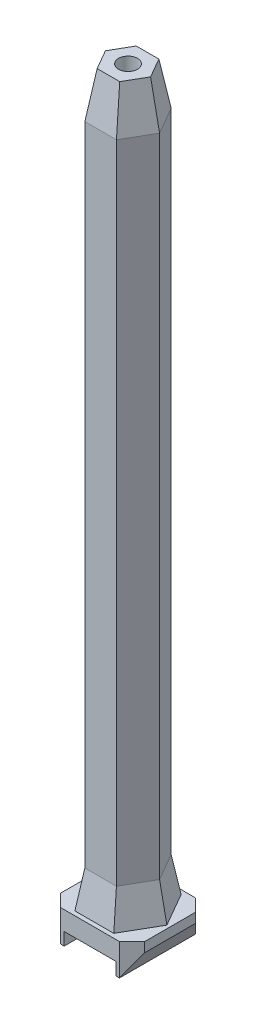
ISO-10303-21;
HEADER;
FILE_DESCRIPTION(('STEP AP214'),'2;1');
FILE_NAME('part.step','',(''),(''),'','','');
FILE_SCHEMA(('AUTOMOTIVE_DESIGN { 1 0 10303 214 1 1 1 1 }'));
ENDSEC;
DATA;
#1=APPLICATION_CONTEXT('core data for automotive mechanical design processes');
#2=APPLICATION_PROTOCOL_DEFINITION('international standard','automotive_design',2000,#1);
#3=PRODUCT_CONTEXT('',#1,'mechanical');
#4=PRODUCT('Part','Part','',(#3));
#5=PRODUCT_RELATED_PRODUCT_CATEGORY('part','',(#4));
#6=PRODUCT_DEFINITION_FORMATION('','',#4);
#7=PRODUCT_DEFINITION_CONTEXT('part definition',#1,'design');
#8=PRODUCT_DEFINITION('design','',#6,#7);
#9=PRODUCT_DEFINITION_SHAPE('','',#8);
#10=(LENGTH_UNIT() NAMED_UNIT(*) SI_UNIT(.MILLI.,.METRE.));
#11=(NAMED_UNIT(*) PLANE_ANGLE_UNIT() SI_UNIT($,.RADIAN.));
#12=(NAMED_UNIT(*) SI_UNIT($,.STERADIAN.) SOLID_ANGLE_UNIT());
#13=UNCERTAINTY_MEASURE_WITH_UNIT(LENGTH_MEASURE(1.E-05),#10,'distance_accuracy_value','');
#14=(GEOMETRIC_REPRESENTATION_CONTEXT(3) GLOBAL_UNCERTAINTY_ASSIGNED_CONTEXT((#13)) GLOBAL_UNIT_ASSIGNED_CONTEXT((#10,
#11,#12)) REPRESENTATION_CONTEXT('',''));
#15=CARTESIAN_POINT('',(0.,0.,0.));
#16=DIRECTION('',(0.,0.,1.));
#17=DIRECTION('',(1.,0.,0.));
#18=AXIS2_PLACEMENT_3D('',#15,#16,#17);
#19=CARTESIAN_POINT('',(6.64652567975831,120.,6.));
#20=DIRECTION('',(-1.,0.,0.));
#21=DIRECTION('',(0.,0.,1.));
#22=AXIS2_PLACEMENT_3D('',#19,#20,#21);
#23=PLANE('',#22);
#24=DIRECTION('',(0.,-1.,0.));
#25=VECTOR('',#24,1.);
#26=CARTESIAN_POINT('',(6.64652567975831,120.,3.99999999999998));
#27=LINE('',#26,#25);
#28=CARTESIAN_POINT('',(6.64652567975831,4.99999999999995,3.99999999999998));
#29=VERTEX_POINT('',#28);
#30=CARTESIAN_POINT('',(6.64652567975831,3.46410161513776,3.99999999999998));
#31=VERTEX_POINT('',#30);
#32=EDGE_CURVE('E293',#29,#31,#27,.T.);
#33=ORIENTED_EDGE('',*,*,#32,.T.);
#34=DIRECTION('',(0.,0.,-1.));
#35=VECTOR('',#34,1.);
#36=CARTESIAN_POINT('',(6.64652567975831,3.46410161513776,-4.));
#37=LINE('',#36,#35);
#38=CARTESIAN_POINT('',(6.64652567975831,3.46410161513776,-4.));
#39=VERTEX_POINT('',#38);
#40=EDGE_CURVE('E341',#31,#39,#37,.T.);
#41=ORIENTED_EDGE('',*,*,#40,.T.);
#42=DIRECTION('',(0.,1.,0.));
#43=VECTOR('',#42,1.);
#44=CARTESIAN_POINT('',(6.64652567975831,120.,-4.));
#45=LINE('',#44,#43);
#46=CARTESIAN_POINT('',(6.64652567975831,4.99999999999995,-4.));
#47=VERTEX_POINT('',#46);
#48=EDGE_CURVE('E296',#39,#47,#45,.T.);
#49=ORIENTED_EDGE('',*,*,#48,.T.);
#50=DIRECTION('',(0.,0.,-1.));
#51=VECTOR('',#50,1.);
#52=CARTESIAN_POINT('',(6.64652567975831,4.99999999999995,6.));
#53=LINE('',#52,#51);
#54=EDGE_CURVE('E390',#29,#47,#53,.T.);
#55=ORIENTED_EDGE('',*,*,#54,.F.);
#56=EDGE_LOOP('',(#33,#41,#49,#55));
#57=FACE_BOUND('',#56,.T.);
#58=ADVANCED_FACE('F36',(#57),#23,.F.);
#59=CARTESIAN_POINT('',(-6.64652567975831,120.,-6.));
#60=DIRECTION('',(0.,0.,1.));
#61=DIRECTION('',(1.,0.,0.));
#62=AXIS2_PLACEMENT_3D('',#59,#60,#61);
#63=PLANE('',#62);
#64=DIRECTION('',(-1.,0.,0.));
#65=VECTOR('',#64,1.);
#66=CARTESIAN_POINT('',(-6.64652567975831,4.99999999999995,-6.));
#67=LINE('',#66,#65);
#68=CARTESIAN_POINT('',(4.64652567975831,4.99999999999995,-6.));
#69=VERTEX_POINT('',#68);
#70=CARTESIAN_POINT('',(-4.64652567975828,4.99999999999995,-6.));
#71=VERTEX_POINT('',#70);
#72=EDGE_CURVE('E387',#69,#71,#67,.T.);
#73=ORIENTED_EDGE('',*,*,#72,.F.);
#74=DIRECTION('',(0.,-1.,0.));
#75=VECTOR('',#74,1.);
#76=CARTESIAN_POINT('',(4.64652567975831,120.,-6.));
#77=LINE('',#76,#75);
#78=CARTESIAN_POINT('',(4.64652567975831,0.,-6.));
#79=VERTEX_POINT('',#78);
#80=EDGE_CURVE('E290',#69,#79,#77,.T.);
#81=ORIENTED_EDGE('',*,*,#80,.T.);
#82=DIRECTION('',(-1.,0.,0.));
#83=VECTOR('',#82,1.);
#84=CARTESIAN_POINT('',(-6.64652567975831,0.,-6.));
#85=LINE('',#84,#83);
#86=CARTESIAN_POINT('',(4.1,0.,-6.));
#87=VERTEX_POINT('',#86);
#88=EDGE_CURVE('E224',#79,#87,#85,.T.);
#89=ORIENTED_EDGE('',*,*,#88,.T.);
#90=DIRECTION('',(0.,1.,0.));
#91=VECTOR('',#90,1.);
#92=CARTESIAN_POINT('',(4.1,120.,-6.));
#93=LINE('',#92,#91);
#94=CARTESIAN_POINT('',(4.1,2.,-6.));
#95=VERTEX_POINT('',#94);
#96=EDGE_CURVE('E227',#87,#95,#93,.T.);
#97=ORIENTED_EDGE('',*,*,#96,.T.);
#98=DIRECTION('',(-1.,0.,0.));
#99=VECTOR('',#98,1.);
#100=CARTESIAN_POINT('',(-6.64652567975831,2.,-6.));
#101=LINE('',#100,#99);
#102=CARTESIAN_POINT('',(-4.1,2.,-6.));
#103=VERTEX_POINT('',#102);
#104=EDGE_CURVE('E220',#95,#103,#101,.T.);
#105=ORIENTED_EDGE('',*,*,#104,.T.);
#106=DIRECTION('',(0.,-1.,0.));
#107=VECTOR('',#106,1.);
#108=CARTESIAN_POINT('',(-4.1,120.,-6.));
#109=LINE('',#108,#107);
#110=CARTESIAN_POINT('',(-4.1,0.,-6.));
#111=VERTEX_POINT('',#110);
#112=EDGE_CURVE('E203',#103,#111,#109,.T.);
#113=ORIENTED_EDGE('',*,*,#112,.T.);
#114=CARTESIAN_POINT('',(-4.64652567975828,0.,-6.));
#115=VERTEX_POINT('',#114);
#116=EDGE_CURVE('E218',#111,#115,#85,.T.);
#117=ORIENTED_EDGE('',*,*,#116,.T.);
#118=DIRECTION('',(0.,1.,0.));
#119=VECTOR('',#118,1.);
#120=CARTESIAN_POINT('',(-4.64652567975828,120.,-6.));
#121=LINE('',#120,#119);
#122=EDGE_CURVE('E270',#115,#71,#121,.T.);
#123=ORIENTED_EDGE('',*,*,#122,.T.);
#124=EDGE_LOOP('',(#73,#81,#89,#97,#105,#113,#117,#123));
#125=FACE_BOUND('',#124,.T.);
#126=ADVANCED_FACE('F217',(#125),#63,.F.);
#127=CARTESIAN_POINT('',(-6.64652567975831,120.,6.));
#128=DIRECTION('',(1.,0.,0.));
#129=DIRECTION('',(0.,0.,-1.));
#130=AXIS2_PLACEMENT_3D('',#127,#128,#129);
#131=PLANE('',#130);
#132=DIRECTION('',(0.,-1.,0.));
#133=VECTOR('',#132,1.);
#134=CARTESIAN_POINT('',(-6.64652567975831,120.,-3.99999999999998));
#135=LINE('',#134,#133);
#136=CARTESIAN_POINT('',(-6.64652567975831,4.99999999999995,-3.99999999999998));
#137=VERTEX_POINT('',#136);
#138=CARTESIAN_POINT('',(-6.64652567975831,3.46410161513776,-3.99999999999998));
#139=VERTEX_POINT('',#138);
#140=EDGE_CURVE('E308',#137,#139,#135,.T.);
#141=ORIENTED_EDGE('',*,*,#140,.T.);
#142=DIRECTION('',(0.,0.,1.));
#143=VECTOR('',#142,1.);
#144=CARTESIAN_POINT('',(-6.64652567975831,3.46410161513776,4.));
#145=LINE('',#144,#143);
#146=CARTESIAN_POINT('',(-6.64652567975831,3.46410161513776,4.));
#147=VERTEX_POINT('',#146);
#148=EDGE_CURVE('E365',#139,#147,#145,.T.);
#149=ORIENTED_EDGE('',*,*,#148,.T.);
#150=DIRECTION('',(0.,1.,0.));
#151=VECTOR('',#150,1.);
#152=CARTESIAN_POINT('',(-6.64652567975831,120.,4.));
#153=LINE('',#152,#151);
#154=CARTESIAN_POINT('',(-6.64652567975831,4.99999999999995,4.));
#155=VERTEX_POINT('',#154);
#156=EDGE_CURVE('E306',#147,#155,#153,.T.);
#157=ORIENTED_EDGE('',*,*,#156,.T.);
#158=DIRECTION('',(0.,0.,1.));
#159=VECTOR('',#158,1.);
#160=CARTESIAN_POINT('',(-6.64652567975831,4.99999999999995,6.));
#161=LINE('',#160,#159);
#162=EDGE_CURVE('E380',#137,#155,#161,.T.);
#163=ORIENTED_EDGE('',*,*,#162,.F.);
#164=EDGE_LOOP('',(#141,#149,#157,#163));
#165=FACE_BOUND('',#164,.T.);
#166=ADVANCED_FACE('F377',(#165),#131,.F.);
#167=CARTESIAN_POINT('',(-6.64652567975831,120.,6.));
#168=DIRECTION('',(0.,0.,-1.));
#169=DIRECTION('',(-1.,0.,0.));
#170=AXIS2_PLACEMENT_3D('',#167,#168,#169);
#171=PLANE('',#170);
#172=DIRECTION('',(1.,0.,0.));
#173=VECTOR('',#172,1.);
#174=CARTESIAN_POINT('',(-6.64652567975831,0.,6.));
#175=LINE('',#174,#173);
#176=CARTESIAN_POINT('',(4.1,0.,6.));
#177=VERTEX_POINT('',#176);
#178=CARTESIAN_POINT('',(4.64652567975828,0.,6.));
#179=VERTEX_POINT('',#178);
#180=EDGE_CURVE('E226',#177,#179,#175,.T.);
#181=ORIENTED_EDGE('',*,*,#180,.T.);
#182=DIRECTION('',(0.,1.,0.));
#183=VECTOR('',#182,1.);
#184=CARTESIAN_POINT('',(4.64652567975828,120.,6.));
#185=LINE('',#184,#183);
#186=CARTESIAN_POINT('',(4.64652567975828,4.99999999999995,6.));
#187=VERTEX_POINT('',#186);
#188=EDGE_CURVE('E313',#179,#187,#185,.T.);
#189=ORIENTED_EDGE('',*,*,#188,.T.);
#190=DIRECTION('',(1.,0.,0.));
#191=VECTOR('',#190,1.);
#192=CARTESIAN_POINT('',(-6.64652567975831,4.99999999999995,6.));
#193=LINE('',#192,#191);
#194=CARTESIAN_POINT('',(-4.6465256797583,4.99999999999995,6.));
#195=VERTEX_POINT('',#194);
#196=EDGE_CURVE('E236',#195,#187,#193,.T.);
#197=ORIENTED_EDGE('',*,*,#196,.F.);
#198=DIRECTION('',(0.,-1.,0.));
#199=VECTOR('',#198,1.);
#200=CARTESIAN_POINT('',(-4.6465256797583,120.,6.));
#201=LINE('',#200,#199);
#202=CARTESIAN_POINT('',(-4.6465256797583,0.,6.));
#203=VERTEX_POINT('',#202);
#204=EDGE_CURVE('E310',#195,#203,#201,.T.);
#205=ORIENTED_EDGE('',*,*,#204,.T.);
#206=CARTESIAN_POINT('',(-4.1,0.,6.));
#207=VERTEX_POINT('',#206);
#208=EDGE_CURVE('E211',#203,#207,#175,.T.);
#209=ORIENTED_EDGE('',*,*,#208,.T.);
#210=DIRECTION('',(0.,1.,0.));
#211=VECTOR('',#210,1.);
#212=CARTESIAN_POINT('',(-4.1,120.,6.));
#213=LINE('',#212,#211);
#214=CARTESIAN_POINT('',(-4.1,2.,6.));
#215=VERTEX_POINT('',#214);
#216=EDGE_CURVE('E206',#207,#215,#213,.T.);
#217=ORIENTED_EDGE('',*,*,#216,.T.);
#218=DIRECTION('',(1.,0.,0.));
#219=VECTOR('',#218,1.);
#220=CARTESIAN_POINT('',(-6.64652567975831,2.,6.));
#221=LINE('',#220,#219);
#222=CARTESIAN_POINT('',(4.1,2.,6.));
#223=VERTEX_POINT('',#222);
#224=EDGE_CURVE('E233',#215,#223,#221,.T.);
#225=ORIENTED_EDGE('',*,*,#224,.T.);
#226=DIRECTION('',(0.,-1.,0.));
#227=VECTOR('',#226,1.);
#228=CARTESIAN_POINT('',(4.1,120.,6.));
#229=LINE('',#228,#227);
#230=EDGE_CURVE('E221',#223,#177,#229,.T.);
#231=ORIENTED_EDGE('',*,*,#230,.T.);
#232=EDGE_LOOP('',(#181,#189,#197,#205,#209,#217,#225,#231));
#233=FACE_BOUND('',#232,.T.);
#234=ADVANCED_FACE('F375',(#233),#171,.F.);
#235=CARTESIAN_POINT('',(0.,120.,0.));
#236=DIRECTION('',(0.,-1.,0.));
#237=DIRECTION('',(0.,0.,-1.));
#238=AXIS2_PLACEMENT_3D('',#235,#236,#237);
#239=PLANE('',#238);
#240=DIRECTION('',(0.5,0.,0.866025403784438));
#241=VECTOR('',#240,1.);
#242=CARTESIAN_POINT('',(-1.43107448733702,120.,3.71298258644256));
#243=LINE('',#242,#241);
#244=CARTESIAN_POINT('',(-3.57476598311603,120.,0.));
#245=VERTEX_POINT('',#244);
#246=CARTESIAN_POINT('',(-1.78738299155801,120.,3.09583815396293));
#247=VERTEX_POINT('',#246);
#248=EDGE_CURVE('E323',#245,#247,#243,.T.);
#249=ORIENTED_EDGE('',*,*,#248,.T.);
#250=DIRECTION('',(1.,0.,0.));
#251=VECTOR('',#250,1.);
#252=CARTESIAN_POINT('',(2.5,120.,3.09583815396293));
#253=LINE('',#252,#251);
#254=CARTESIAN_POINT('',(1.78738299155801,120.,3.09583815396293));
#255=VERTEX_POINT('',#254);
#256=EDGE_CURVE('E325',#247,#255,#253,.T.);
#257=ORIENTED_EDGE('',*,*,#256,.T.);
#258=DIRECTION('',(0.5,0.,-0.866025403784439));
#259=VECTOR('',#258,1.);
#260=CARTESIAN_POINT('',(3.93107448733702,120.,-0.617144432479631));
#261=LINE('',#260,#259);
#262=CARTESIAN_POINT('',(3.57476598311603,120.,0.));
#263=VERTEX_POINT('',#262);
#264=EDGE_CURVE('E315',#255,#263,#261,.T.);
#265=ORIENTED_EDGE('',*,*,#264,.T.);
#266=DIRECTION('',(-0.5,0.,-0.866025403784439));
#267=VECTOR('',#266,1.);
#268=CARTESIAN_POINT('',(1.43107448733702,120.,-3.71298258644256));
#269=LINE('',#268,#267);
#270=CARTESIAN_POINT('',(1.78738299155801,120.,-3.09583815396293));
#271=VERTEX_POINT('',#270);
#272=EDGE_CURVE('E317',#263,#271,#269,.T.);
#273=ORIENTED_EDGE('',*,*,#272,.T.);
#274=DIRECTION('',(-1.,0.,0.));
#275=VECTOR('',#274,1.);
#276=CARTESIAN_POINT('',(-2.5,120.,-3.09583815396293));
#277=LINE('',#276,#275);
#278=CARTESIAN_POINT('',(-1.78738299155801,120.,-3.09583815396293));
#279=VERTEX_POINT('',#278);
#280=EDGE_CURVE('E319',#271,#279,#277,.T.);
#281=ORIENTED_EDGE('',*,*,#280,.T.);
#282=DIRECTION('',(-0.5,0.,0.866025403784439));
#283=VECTOR('',#282,1.);
#284=CARTESIAN_POINT('',(-3.93107448733702,120.,0.617144432479633));
#285=LINE('',#284,#283);
#286=EDGE_CURVE('E321',#279,#245,#285,.T.);
#287=ORIENTED_EDGE('',*,*,#286,.T.);
#288=EDGE_LOOP('',(#249,#257,#265,#273,#281,#287));
#289=FACE_BOUND('',#288,.T.);
#290=CARTESIAN_POINT('',(0.,120.,0.));
#291=DIRECTION('',(0.,1.,0.));
#292=DIRECTION('',(0.,0.,1.));
#293=AXIS2_PLACEMENT_3D('',#290,#291,#292);
#294=CIRCLE('',#293,1.5);
#295=CARTESIAN_POINT('',(0.,120.,1.5));
#296=VERTEX_POINT('',#295);
#297=EDGE_CURVE('E241',#296,#296,#294,.T.);
#298=ORIENTED_EDGE('',*,*,#297,.F.);
#299=EDGE_LOOP('',(#298));
#300=FACE_BOUND('',#299,.T.);
#301=ADVANCED_FACE('F568',(#289,#300),#239,.F.);
#302=CARTESIAN_POINT('',(0.,0.,0.));
#303=DIRECTION('',(0.,-1.,0.));
#304=DIRECTION('',(0.,0.,-1.));
#305=AXIS2_PLACEMENT_3D('',#302,#303,#304);
#306=PLANE('',#305);
#307=ORIENTED_EDGE('',*,*,#88,.F.);
#308=DIRECTION('',(0.,0.,1.));
#309=VECTOR('',#308,1.);
#310=CARTESIAN_POINT('',(4.6465256797583,0.,3.99999999999998));
#311=LINE('',#310,#309);
#312=EDGE_CURVE('E361',#79,#179,#311,.T.);
#313=ORIENTED_EDGE('',*,*,#312,.T.);
#314=ORIENTED_EDGE('',*,*,#180,.F.);
#315=DIRECTION('',(0.,0.,1.));
#316=VECTOR('',#315,1.);
#317=CARTESIAN_POINT('',(4.1,0.,0.));
#318=LINE('',#317,#316);
#319=EDGE_CURVE('E210',#87,#177,#318,.T.);
#320=ORIENTED_EDGE('',*,*,#319,.F.);
#321=EDGE_LOOP('',(#307,#313,#314,#320));
#322=FACE_BOUND('',#321,.T.);
#323=ADVANCED_FACE('F413',(#322),#306,.T.);
#324=ORIENTED_EDGE('',*,*,#208,.F.);
#325=DIRECTION('',(0.,0.,-1.));
#326=VECTOR('',#325,1.);
#327=CARTESIAN_POINT('',(-4.6465256797583,0.,-3.99999999999998));
#328=LINE('',#327,#326);
#329=EDGE_CURVE('E45',#203,#115,#328,.T.);
#330=ORIENTED_EDGE('',*,*,#329,.T.);
#331=ORIENTED_EDGE('',*,*,#116,.F.);
#332=DIRECTION('',(0.,0.,-1.));
#333=VECTOR('',#332,1.);
#334=CARTESIAN_POINT('',(-4.1,0.,0.));
#335=LINE('',#334,#333);
#336=EDGE_CURVE('E199',#207,#111,#335,.T.);
#337=ORIENTED_EDGE('',*,*,#336,.F.);
#338=EDGE_LOOP('',(#324,#330,#331,#337));
#339=FACE_BOUND('',#338,.T.);
#340=ADVANCED_FACE('F223',(#339),#306,.T.);
#341=CARTESIAN_POINT('',(0.,2.,0.));
#342=DIRECTION('',(0.,1.,0.));
#343=DIRECTION('',(0.,0.,1.));
#344=AXIS2_PLACEMENT_3D('',#341,#342,#343);
#345=PLANE('',#344);
#346=CARTESIAN_POINT('',(0.,2.,0.));
#347=DIRECTION('',(0.,1.,0.));
#348=DIRECTION('',(0.,0.,1.));
#349=AXIS2_PLACEMENT_3D('',#346,#347,#348);
#350=CIRCLE('',#349,1.5);
#351=CARTESIAN_POINT('',(0.,2.,1.5));
#352=VERTEX_POINT('',#351);
#353=EDGE_CURVE('E237',#352,#352,#350,.T.);
#354=ORIENTED_EDGE('',*,*,#353,.T.);
#355=EDGE_LOOP('',(#354));
#356=FACE_BOUND('',#355,.T.);
#357=DIRECTION('',(0.,0.,1.));
#358=VECTOR('',#357,1.);
#359=CARTESIAN_POINT('',(4.1,2.,-27.0139960234309));
#360=LINE('',#359,#358);
#361=EDGE_CURVE('E240',#95,#223,#360,.T.);
#362=ORIENTED_EDGE('',*,*,#361,.T.);
#363=ORIENTED_EDGE('',*,*,#224,.F.);
#364=DIRECTION('',(0.,0.,-1.));
#365=VECTOR('',#364,1.);
#366=CARTESIAN_POINT('',(-4.1,2.,-27.0139960234309));
#367=LINE('',#366,#365);
#368=EDGE_CURVE('E401',#215,#103,#367,.T.);
#369=ORIENTED_EDGE('',*,*,#368,.T.);
#370=ORIENTED_EDGE('',*,*,#104,.F.);
#371=EDGE_LOOP('',(#362,#363,#369,#370));
#372=FACE_BOUND('',#371,.T.);
#373=ADVANCED_FACE('F679',(#356,#372),#345,.F.);
#374=CARTESIAN_POINT('',(4.1,2.,-27.0139960234309));
#375=DIRECTION('',(1.,0.,0.));
#376=DIRECTION('',(0.,0.,-1.));
#377=AXIS2_PLACEMENT_3D('',#374,#375,#376);
#378=PLANE('',#377);
#379=ORIENTED_EDGE('',*,*,#319,.T.);
#380=ORIENTED_EDGE('',*,*,#230,.F.);
#381=ORIENTED_EDGE('',*,*,#361,.F.);
#382=ORIENTED_EDGE('',*,*,#96,.F.);
#383=EDGE_LOOP('',(#379,#380,#381,#382));
#384=FACE_BOUND('',#383,.T.);
#385=ADVANCED_FACE('F410',(#384),#378,.F.);
#386=CARTESIAN_POINT('',(-4.1,2.,-27.0139960234309));
#387=DIRECTION('',(-1.,0.,0.));
#388=DIRECTION('',(0.,0.,1.));
#389=AXIS2_PLACEMENT_3D('',#386,#387,#388);
#390=PLANE('',#389);
#391=ORIENTED_EDGE('',*,*,#368,.F.);
#392=ORIENTED_EDGE('',*,*,#216,.F.);
#393=ORIENTED_EDGE('',*,*,#336,.T.);
#394=ORIENTED_EDGE('',*,*,#112,.F.);
#395=EDGE_LOOP('',(#391,#392,#393,#394));
#396=FACE_BOUND('',#395,.T.);
#397=ADVANCED_FACE('F202',(#396),#390,.F.);
#398=CARTESIAN_POINT('',(0.,-20.,0.));
#399=DIRECTION('',(0.,1.,0.));
#400=DIRECTION('',(0.,0.,1.));
#401=AXIS2_PLACEMENT_3D('',#398,#399,#400);
#402=CYLINDRICAL_SURFACE('',#401,1.5);
#403=ORIENTED_EDGE('',*,*,#297,.T.);
#404=EDGE_LOOP('',(#403));
#405=FACE_BOUND('',#404,.T.);
#406=ORIENTED_EDGE('',*,*,#353,.F.);
#407=EDGE_LOOP('',(#406));
#408=FACE_BOUND('',#407,.T.);
#409=ADVANCED_FACE('F787',(#405,#408),#402,.F.);
#410=CARTESIAN_POINT('',(0.,4.99999999999995,0.));
#411=DIRECTION('',(0.,1.,0.));
#412=DIRECTION('',(0.,0.,1.));
#413=AXIS2_PLACEMENT_3D('',#410,#411,#412);
#414=PLANE('',#413);
#415=DIRECTION('',(-0.5,0.,-0.866025403784438));
#416=VECTOR('',#415,1.);
#417=CARTESIAN_POINT('',(-5.86602540378444,4.99999999999995,0.500000000000003));
#418=LINE('',#417,#416);
#419=CARTESIAN_POINT('',(-3.07735026918962,4.99999999999995,5.33012701892219));
#420=VERTEX_POINT('',#419);
#421=CARTESIAN_POINT('',(-6.15470053837925,4.99999999999995,0.));
#422=VERTEX_POINT('',#421);
#423=EDGE_CURVE('E247',#420,#422,#418,.T.);
#424=ORIENTED_EDGE('',*,*,#423,.T.);
#425=DIRECTION('',(0.5,0.,-0.866025403784439));
#426=VECTOR('',#425,1.);
#427=CARTESIAN_POINT('',(-3.36602540378444,4.99999999999995,-4.83012701892219));
#428=LINE('',#427,#426);
#429=CARTESIAN_POINT('',(-3.07735026918963,4.99999999999995,-5.33012701892219));
#430=VERTEX_POINT('',#429);
#431=EDGE_CURVE('E257',#422,#430,#428,.T.);
#432=ORIENTED_EDGE('',*,*,#431,.T.);
#433=DIRECTION('',(1.,0.,0.));
#434=VECTOR('',#433,1.);
#435=CARTESIAN_POINT('',(2.5,4.99999999999995,-5.33012701892219));
#436=LINE('',#435,#434);
#437=CARTESIAN_POINT('',(3.07735026918963,4.99999999999995,-5.33012701892219));
#438=VERTEX_POINT('',#437);
#439=EDGE_CURVE('E255',#430,#438,#436,.T.);
#440=ORIENTED_EDGE('',*,*,#439,.T.);
#441=DIRECTION('',(0.5,0.,0.866025403784439));
#442=VECTOR('',#441,1.);
#443=CARTESIAN_POINT('',(5.86602540378444,4.99999999999995,-0.500000000000002));
#444=LINE('',#443,#442);
#445=CARTESIAN_POINT('',(6.15470053837925,4.99999999999995,0.));
#446=VERTEX_POINT('',#445);
#447=EDGE_CURVE('E253',#438,#446,#444,.T.);
#448=ORIENTED_EDGE('',*,*,#447,.T.);
#449=DIRECTION('',(-0.5,0.,0.866025403784439));
#450=VECTOR('',#449,1.);
#451=CARTESIAN_POINT('',(3.36602540378444,4.99999999999995,4.83012701892219));
#452=LINE('',#451,#450);
#453=CARTESIAN_POINT('',(3.07735026918963,4.99999999999995,5.33012701892219));
#454=VERTEX_POINT('',#453);
#455=EDGE_CURVE('E251',#446,#454,#452,.T.);
#456=ORIENTED_EDGE('',*,*,#455,.T.);
#457=DIRECTION('',(-1.,0.,0.));
#458=VECTOR('',#457,1.);
#459=CARTESIAN_POINT('',(-2.5,4.99999999999995,5.33012701892219));
#460=LINE('',#459,#458);
#461=EDGE_CURVE('E249',#454,#420,#460,.T.);
#462=ORIENTED_EDGE('',*,*,#461,.T.);
#463=EDGE_LOOP('',(#424,#432,#440,#448,#456,#462));
#464=FACE_BOUND('',#463,.T.);
#465=ORIENTED_EDGE('',*,*,#54,.T.);
#466=DIRECTION('',(0.707106781186548,0.,0.707106781186548));
#467=VECTOR('',#466,1.);
#468=CARTESIAN_POINT('',(5.32326283987915,4.99999999999995,-5.32326283987915));
#469=LINE('',#468,#467);
#470=EDGE_CURVE('E304',#47,#69,#469,.F.);
#471=ORIENTED_EDGE('',*,*,#470,.T.);
#472=ORIENTED_EDGE('',*,*,#72,.T.);
#473=DIRECTION('',(0.70710678118655,0.,-0.707106781186545));
#474=VECTOR('',#473,1.);
#475=CARTESIAN_POINT('',(-5.32326283987912,4.99999999999995,-5.32326283987916));
#476=LINE('',#475,#474);
#477=EDGE_CURVE('E302',#71,#137,#476,.F.);
#478=ORIENTED_EDGE('',*,*,#477,.T.);
#479=ORIENTED_EDGE('',*,*,#162,.T.);
#480=DIRECTION('',(-0.707106781186548,0.,-0.707106781186548));
#481=VECTOR('',#480,1.);
#482=CARTESIAN_POINT('',(-5.32326283987915,4.99999999999995,5.32326283987915));
#483=LINE('',#482,#481);
#484=EDGE_CURVE('E298',#155,#195,#483,.F.);
#485=ORIENTED_EDGE('',*,*,#484,.T.);
#486=ORIENTED_EDGE('',*,*,#196,.T.);
#487=DIRECTION('',(-0.70710678118655,0.,0.707106781186545));
#488=VECTOR('',#487,1.);
#489=CARTESIAN_POINT('',(5.32326283987913,4.99999999999995,5.32326283987916));
#490=LINE('',#489,#488);
#491=EDGE_CURVE('E300',#187,#29,#490,.F.);
#492=ORIENTED_EDGE('',*,*,#491,.T.);
#493=EDGE_LOOP('',(#465,#471,#472,#478,#479,#485,#486,#492));
#494=FACE_BOUND('',#493,.T.);
#495=ADVANCED_FACE('F386',(#464,#494),#414,.T.);
#496=CARTESIAN_POINT('',(2.5,4.99999999999995,4.33012701892219));
#497=DIRECTION('',(0.866025403784439,0.,0.5));
#498=DIRECTION('',(0.5,0.,-0.866025403784439));
#499=AXIS2_PLACEMENT_3D('',#496,#497,#498);
#500=PLANE('',#499);
#501=DIRECTION('',(0.,1.,0.));
#502=VECTOR('',#501,1.);
#503=CARTESIAN_POINT('',(5.,4.99999999999995,0.));
#504=LINE('',#503,#502);
#505=CARTESIAN_POINT('',(5.,10.6712818196179,0.));
#506=VERTEX_POINT('',#505);
#507=CARTESIAN_POINT('',(5.,113.,0.));
#508=VERTEX_POINT('',#507);
#509=EDGE_CURVE('E288',#506,#508,#504,.T.);
#510=ORIENTED_EDGE('',*,*,#509,.T.);
#511=DIRECTION('',(-0.5,0.,0.866025403784439));
#512=VECTOR('',#511,1.);
#513=CARTESIAN_POINT('',(2.5,113.,4.33012701892219));
#514=LINE('',#513,#512);
#515=CARTESIAN_POINT('',(2.5,113.,4.33012701892219));
#516=VERTEX_POINT('',#515);
#517=EDGE_CURVE('E339',#508,#516,#514,.T.);
#518=ORIENTED_EDGE('',*,*,#517,.T.);
#519=DIRECTION('',(0.,1.,0.));
#520=VECTOR('',#519,1.);
#521=CARTESIAN_POINT('',(2.5,4.99999999999995,4.33012701892219));
#522=LINE('',#521,#520);
#523=CARTESIAN_POINT('',(2.5,10.6712818196179,4.33012701892219));
#524=VERTEX_POINT('',#523);
#525=EDGE_CURVE('E393',#524,#516,#522,.T.);
#526=ORIENTED_EDGE('',*,*,#525,.F.);
#527=DIRECTION('',(0.5,0.,-0.866025403784439));
#528=VECTOR('',#527,1.);
#529=CARTESIAN_POINT('',(5.,10.6712818196179,0.));
#530=LINE('',#529,#528);
#531=EDGE_CURVE('E264',#524,#506,#530,.T.);
#532=ORIENTED_EDGE('',*,*,#531,.T.);
#533=EDGE_LOOP('',(#510,#518,#526,#532));
#534=FACE_BOUND('',#533,.T.);
#535=ADVANCED_FACE('F532',(#534),#500,.T.);
#536=CARTESIAN_POINT('',(-2.5,4.99999999999995,4.33012701892219));
#537=DIRECTION('',(0.,0.,1.));
#538=DIRECTION('',(1.,0.,0.));
#539=AXIS2_PLACEMENT_3D('',#536,#537,#538);
#540=PLANE('',#539);
#541=ORIENTED_EDGE('',*,*,#525,.T.);
#542=DIRECTION('',(-1.,0.,0.));
#543=VECTOR('',#542,1.);
#544=CARTESIAN_POINT('',(-2.5,113.,4.33012701892219));
#545=LINE('',#544,#543);
#546=CARTESIAN_POINT('',(-2.5,113.,4.33012701892219));
#547=VERTEX_POINT('',#546);
#548=EDGE_CURVE('E328',#516,#547,#545,.T.);
#549=ORIENTED_EDGE('',*,*,#548,.T.);
#550=DIRECTION('',(0.,1.,0.));
#551=VECTOR('',#550,1.);
#552=CARTESIAN_POINT('',(-2.5,4.99999999999995,4.33012701892219));
#553=LINE('',#552,#551);
#554=CARTESIAN_POINT('',(-2.5,10.6712818196179,4.33012701892219));
#555=VERTEX_POINT('',#554);
#556=EDGE_CURVE('E524',#555,#547,#553,.T.);
#557=ORIENTED_EDGE('',*,*,#556,.F.);
#558=DIRECTION('',(1.,0.,0.));
#559=VECTOR('',#558,1.);
#560=CARTESIAN_POINT('',(2.5,10.6712818196179,4.33012701892219));
#561=LINE('',#560,#559);
#562=EDGE_CURVE('E266',#555,#524,#561,.T.);
#563=ORIENTED_EDGE('',*,*,#562,.T.);
#564=EDGE_LOOP('',(#541,#549,#557,#563));
#565=FACE_BOUND('',#564,.T.);
#566=ADVANCED_FACE('F553',(#565),#540,.T.);
#567=CARTESIAN_POINT('',(-5.,4.99999999999995,0.));
#568=DIRECTION('',(-0.866025403784438,0.,0.5));
#569=DIRECTION('',(0.5,0.,0.866025403784438));
#570=AXIS2_PLACEMENT_3D('',#567,#568,#569);
#571=PLANE('',#570);
#572=ORIENTED_EDGE('',*,*,#556,.T.);
#573=DIRECTION('',(-0.5,0.,-0.866025403784438));
#574=VECTOR('',#573,1.);
#575=CARTESIAN_POINT('',(-5.,113.,0.));
#576=LINE('',#575,#574);
#577=CARTESIAN_POINT('',(-5.,113.,0.));
#578=VERTEX_POINT('',#577);
#579=EDGE_CURVE('E331',#547,#578,#576,.T.);
#580=ORIENTED_EDGE('',*,*,#579,.T.);
#581=DIRECTION('',(0.,1.,0.));
#582=VECTOR('',#581,1.);
#583=CARTESIAN_POINT('',(-5.,4.99999999999995,0.));
#584=LINE('',#583,#582);
#585=CARTESIAN_POINT('',(-5.,10.6712818196179,0.));
#586=VERTEX_POINT('',#585);
#587=EDGE_CURVE('E522',#586,#578,#584,.T.);
#588=ORIENTED_EDGE('',*,*,#587,.F.);
#589=DIRECTION('',(0.5,0.,0.866025403784438));
#590=VECTOR('',#589,1.);
#591=CARTESIAN_POINT('',(-2.5,10.6712818196179,4.33012701892219));
#592=LINE('',#591,#590);
#593=EDGE_CURVE('E268',#586,#555,#592,.T.);
#594=ORIENTED_EDGE('',*,*,#593,.T.);
#595=EDGE_LOOP('',(#572,#580,#588,#594));
#596=FACE_BOUND('',#595,.T.);
#597=ADVANCED_FACE('F555',(#596),#571,.T.);
#598=CARTESIAN_POINT('',(-2.5,4.99999999999995,-4.33012701892219));
#599=DIRECTION('',(-0.866025403784439,0.,-0.5));
#600=DIRECTION('',(-0.5,0.,0.866025403784439));
#601=AXIS2_PLACEMENT_3D('',#598,#599,#600);
#602=PLANE('',#601);
#603=ORIENTED_EDGE('',*,*,#587,.T.);
#604=DIRECTION('',(0.5,0.,-0.866025403784439));
#605=VECTOR('',#604,1.);
#606=CARTESIAN_POINT('',(-2.5,113.,-4.33012701892219));
#607=LINE('',#606,#605);
#608=CARTESIAN_POINT('',(-2.5,113.,-4.33012701892219));
#609=VERTEX_POINT('',#608);
#610=EDGE_CURVE('E333',#578,#609,#607,.T.);
#611=ORIENTED_EDGE('',*,*,#610,.T.);
#612=DIRECTION('',(0.,1.,0.));
#613=VECTOR('',#612,1.);
#614=CARTESIAN_POINT('',(-2.5,4.99999999999995,-4.33012701892219));
#615=LINE('',#614,#613);
#616=CARTESIAN_POINT('',(-2.5,10.6712818196179,-4.33012701892219));
#617=VERTEX_POINT('',#616);
#618=EDGE_CURVE('E513',#617,#609,#615,.T.);
#619=ORIENTED_EDGE('',*,*,#618,.F.);
#620=DIRECTION('',(-0.5,0.,0.866025403784439));
#621=VECTOR('',#620,1.);
#622=CARTESIAN_POINT('',(-5.,10.6712818196179,0.));
#623=LINE('',#622,#621);
#624=EDGE_CURVE('E244',#617,#586,#623,.T.);
#625=ORIENTED_EDGE('',*,*,#624,.T.);
#626=EDGE_LOOP('',(#603,#611,#619,#625));
#627=FACE_BOUND('',#626,.T.);
#628=ADVANCED_FACE('F519',(#627),#602,.T.);
#629=CARTESIAN_POINT('',(2.5,4.99999999999995,-4.33012701892219));
#630=DIRECTION('',(0.,0.,-1.));
#631=DIRECTION('',(-1.,0.,0.));
#632=AXIS2_PLACEMENT_3D('',#629,#630,#631);
#633=PLANE('',#632);
#634=ORIENTED_EDGE('',*,*,#618,.T.);
#635=DIRECTION('',(1.,0.,0.));
#636=VECTOR('',#635,1.);
#637=CARTESIAN_POINT('',(2.5,113.,-4.33012701892219));
#638=LINE('',#637,#636);
#639=CARTESIAN_POINT('',(2.5,113.,-4.33012701892219));
#640=VERTEX_POINT('',#639);
#641=EDGE_CURVE('E335',#609,#640,#638,.T.);
#642=ORIENTED_EDGE('',*,*,#641,.T.);
#643=DIRECTION('',(0.,1.,0.));
#644=VECTOR('',#643,1.);
#645=CARTESIAN_POINT('',(2.5,4.99999999999995,-4.33012701892219));
#646=LINE('',#645,#644);
#647=CARTESIAN_POINT('',(2.5,10.6712818196179,-4.33012701892219));
#648=VERTEX_POINT('',#647);
#649=EDGE_CURVE('E516',#648,#640,#646,.T.);
#650=ORIENTED_EDGE('',*,*,#649,.F.);
#651=DIRECTION('',(-1.,0.,0.));
#652=VECTOR('',#651,1.);
#653=CARTESIAN_POINT('',(-2.5,10.6712818196179,-4.33012701892219));
#654=LINE('',#653,#652);
#655=EDGE_CURVE('E260',#648,#617,#654,.T.);
#656=ORIENTED_EDGE('',*,*,#655,.T.);
#657=EDGE_LOOP('',(#634,#642,#650,#656));
#658=FACE_BOUND('',#657,.T.);
#659=ADVANCED_FACE('F489',(#658),#633,.T.);
#660=CARTESIAN_POINT('',(5.,4.99999999999995,0.));
#661=DIRECTION('',(0.866025403784439,0.,-0.5));
#662=DIRECTION('',(-0.5,0.,-0.866025403784439));
#663=AXIS2_PLACEMENT_3D('',#660,#661,#662);
#664=PLANE('',#663);
#665=ORIENTED_EDGE('',*,*,#649,.T.);
#666=DIRECTION('',(0.5,0.,0.866025403784439));
#667=VECTOR('',#666,1.);
#668=CARTESIAN_POINT('',(5.,113.,0.));
#669=LINE('',#668,#667);
#670=EDGE_CURVE('E337',#640,#508,#669,.T.);
#671=ORIENTED_EDGE('',*,*,#670,.T.);
#672=ORIENTED_EDGE('',*,*,#509,.F.);
#673=DIRECTION('',(-0.5,0.,-0.866025403784439));
#674=VECTOR('',#673,1.);
#675=CARTESIAN_POINT('',(2.5,10.6712818196179,-4.33012701892219));
#676=LINE('',#675,#674);
#677=EDGE_CURVE('E262',#506,#648,#676,.T.);
#678=ORIENTED_EDGE('',*,*,#677,.T.);
#679=EDGE_LOOP('',(#665,#671,#672,#678));
#680=FACE_BOUND('',#679,.T.);
#681=ADVANCED_FACE('F484',(#680),#664,.T.);
#682=CARTESIAN_POINT('',(2.5,10.6712818196179,4.33012701892219));
#683=DIRECTION('',(0.852868531952444,0.173648177666924,0.492403876506104));
#684=DIRECTION('',(-0.5,0.,0.866025403784439));
#685=AXIS2_PLACEMENT_3D('',#682,#683,#684);
#686=PLANE('',#685);
#687=DIRECTION('',(-0.0997557416394286,0.979895488325092,-0.172782012866204));
#688=VECTOR('',#687,1.);
#689=CARTESIAN_POINT('',(2.45024396004984,11.1600328254529,4.24394702974508));
#690=LINE('',#689,#688);
#691=EDGE_CURVE('E282',#454,#524,#690,.T.);
#692=ORIENTED_EDGE('',*,*,#691,.F.);
#693=ORIENTED_EDGE('',*,*,#455,.F.);
#694=DIRECTION('',(-0.199511483278857,0.979895488325092,0.));
#695=VECTOR('',#694,1.);
#696=CARTESIAN_POINT('',(4.90048792009968,11.1600328254529,0.));
#697=LINE('',#696,#695);
#698=EDGE_CURVE('E285',#506,#446,#697,.F.);
#699=ORIENTED_EDGE('',*,*,#698,.F.);
#700=ORIENTED_EDGE('',*,*,#531,.F.);
#701=EDGE_LOOP('',(#692,#693,#699,#700));
#702=FACE_BOUND('',#701,.T.);
#703=ADVANCED_FACE('F479',(#702),#686,.T.);
#704=CARTESIAN_POINT('',(5.,10.6712818196179,0.));
#705=DIRECTION('',(0.852868531952444,0.173648177666924,-0.492403876506105));
#706=DIRECTION('',(0.5,0.,0.866025403784439));
#707=AXIS2_PLACEMENT_3D('',#704,#705,#706);
#708=PLANE('',#707);
#709=ORIENTED_EDGE('',*,*,#698,.T.);
#710=ORIENTED_EDGE('',*,*,#447,.F.);
#711=DIRECTION('',(-0.0997557416394285,0.979895488325092,0.172782012866204));
#712=VECTOR('',#711,1.);
#713=CARTESIAN_POINT('',(2.45024396004984,11.1600328254529,-4.24394702974508));
#714=LINE('',#713,#712);
#715=EDGE_CURVE('E279',#648,#438,#714,.F.);
#716=ORIENTED_EDGE('',*,*,#715,.F.);
#717=ORIENTED_EDGE('',*,*,#677,.F.);
#718=EDGE_LOOP('',(#709,#710,#716,#717));
#719=FACE_BOUND('',#718,.T.);
#720=ADVANCED_FACE('F473',(#719),#708,.T.);
#721=CARTESIAN_POINT('',(-2.5,10.6712818196179,4.33012701892219));
#722=DIRECTION('',(0.,0.173648177666924,0.984807753012209));
#723=DIRECTION('',(-1.,0.,0.));
#724=AXIS2_PLACEMENT_3D('',#721,#722,#723);
#725=PLANE('',#724);
#726=ORIENTED_EDGE('',*,*,#691,.T.);
#727=ORIENTED_EDGE('',*,*,#562,.F.);
#728=DIRECTION('',(0.0997557416394283,0.979895488325092,-0.172782012866204));
#729=VECTOR('',#728,1.);
#730=CARTESIAN_POINT('',(-2.45024396004984,11.1600328254529,4.24394702974509));
#731=LINE('',#730,#729);
#732=EDGE_CURVE('E276',#420,#555,#731,.T.);
#733=ORIENTED_EDGE('',*,*,#732,.F.);
#734=ORIENTED_EDGE('',*,*,#461,.F.);
#735=EDGE_LOOP('',(#726,#727,#733,#734));
#736=FACE_BOUND('',#735,.T.);
#737=ADVANCED_FACE('F466',(#736),#725,.T.);
#738=CARTESIAN_POINT('',(2.5,10.6712818196179,-4.33012701892219));
#739=DIRECTION('',(0.,0.173648177666924,-0.984807753012209));
#740=DIRECTION('',(1.,0.,0.));
#741=AXIS2_PLACEMENT_3D('',#738,#739,#740);
#742=PLANE('',#741);
#743=ORIENTED_EDGE('',*,*,#715,.T.);
#744=ORIENTED_EDGE('',*,*,#439,.F.);
#745=DIRECTION('',(0.0997557416394284,0.979895488325092,0.172782012866204));
#746=VECTOR('',#745,1.);
#747=CARTESIAN_POINT('',(-2.45024396004984,11.1600328254529,-4.24394702974509));
#748=LINE('',#747,#746);
#749=EDGE_CURVE('E273',#617,#430,#748,.F.);
#750=ORIENTED_EDGE('',*,*,#749,.F.);
#751=ORIENTED_EDGE('',*,*,#655,.F.);
#752=EDGE_LOOP('',(#743,#744,#750,#751));
#753=FACE_BOUND('',#752,.T.);
#754=ADVANCED_FACE('F459',(#753),#742,.T.);
#755=CARTESIAN_POINT('',(-5.,10.6712818196179,0.));
#756=DIRECTION('',(-0.852868531952444,0.173648177666924,0.492403876506105));
#757=DIRECTION('',(-0.5,0.,-0.866025403784438));
#758=AXIS2_PLACEMENT_3D('',#755,#756,#757);
#759=PLANE('',#758);
#760=ORIENTED_EDGE('',*,*,#732,.T.);
#761=ORIENTED_EDGE('',*,*,#593,.F.);
#762=DIRECTION('',(-0.199511483278857,-0.979895488325092,0.));
#763=VECTOR('',#762,1.);
#764=CARTESIAN_POINT('',(-5.,10.6712818196179,0.));
#765=LINE('',#764,#763);
#766=EDGE_CURVE('E271',#422,#586,#765,.F.);
#767=ORIENTED_EDGE('',*,*,#766,.F.);
#768=ORIENTED_EDGE('',*,*,#423,.F.);
#769=EDGE_LOOP('',(#760,#761,#767,#768));
#770=FACE_BOUND('',#769,.T.);
#771=ADVANCED_FACE('F437',(#770),#759,.T.);
#772=CARTESIAN_POINT('',(-2.5,10.6712818196179,-4.33012701892219));
#773=DIRECTION('',(-0.852868531952444,0.173648177666924,-0.492403876506104));
#774=DIRECTION('',(0.5,0.,-0.866025403784439));
#775=AXIS2_PLACEMENT_3D('',#772,#773,#774);
#776=PLANE('',#775);
#777=ORIENTED_EDGE('',*,*,#749,.T.);
#778=ORIENTED_EDGE('',*,*,#431,.F.);
#779=ORIENTED_EDGE('',*,*,#766,.T.);
#780=ORIENTED_EDGE('',*,*,#624,.F.);
#781=EDGE_LOOP('',(#777,#778,#779,#780));
#782=FACE_BOUND('',#781,.T.);
#783=ADVANCED_FACE('F430',(#782),#776,.T.);
#784=CARTESIAN_POINT('',(4.64652567975831,120.,-6.));
#785=DIRECTION('',(-0.707106781186547,0.,0.707106781186547));
#786=DIRECTION('',(0.,-1.,0.));
#787=AXIS2_PLACEMENT_3D('',#784,#785,#786);
#788=PLANE('',#787);
#789=ORIENTED_EDGE('',*,*,#48,.F.);
#790=DIRECTION('',(0.447213595499959,0.774596669241482,0.447213595499959));
#791=VECTOR('',#790,1.);
#792=CARTESIAN_POINT('',(46.2157450614114,71.9999999999998,35.5692193816531));
#793=LINE('',#792,#791);
#794=EDGE_CURVE('E359',#39,#79,#793,.F.);
#795=ORIENTED_EDGE('',*,*,#794,.T.);
#796=ORIENTED_EDGE('',*,*,#80,.F.);
#797=ORIENTED_EDGE('',*,*,#470,.F.);
#798=EDGE_LOOP('',(#789,#795,#796,#797));
#799=FACE_BOUND('',#798,.T.);
#800=ADVANCED_FACE('F428',(#799),#788,.F.);
#801=CARTESIAN_POINT('',(-6.64652567975831,120.,-3.99999999999998));
#802=DIRECTION('',(0.707106781186545,0.,0.70710678118655));
#803=DIRECTION('',(0.,-1.,0.));
#804=AXIS2_PLACEMENT_3D('',#801,#802,#803);
#805=PLANE('',#804);
#806=ORIENTED_EDGE('',*,*,#122,.F.);
#807=DIRECTION('',(0.44721359549996,-0.774596669241483,-0.447213595499956));
#808=VECTOR('',#807,1.);
#809=CARTESIAN_POINT('',(-47.0157450614115,73.3856406460551,36.3692193816529));
#810=LINE('',#809,#808);
#811=EDGE_CURVE('E12',#115,#139,#810,.F.);
#812=ORIENTED_EDGE('',*,*,#811,.T.);
#813=ORIENTED_EDGE('',*,*,#140,.F.);
#814=ORIENTED_EDGE('',*,*,#477,.F.);
#815=EDGE_LOOP('',(#806,#812,#813,#814));
#816=FACE_BOUND('',#815,.T.);
#817=ADVANCED_FACE('F382',(#816),#805,.F.);
#818=CARTESIAN_POINT('',(6.64652567975831,120.,3.99999999999998));
#819=DIRECTION('',(-0.707106781186545,0.,-0.70710678118655));
#820=DIRECTION('',(0.,-1.,0.));
#821=AXIS2_PLACEMENT_3D('',#818,#819,#820);
#822=PLANE('',#821);
#823=ORIENTED_EDGE('',*,*,#188,.F.);
#824=DIRECTION('',(-0.44721359549996,-0.774596669241483,0.447213595499956));
#825=VECTOR('',#824,1.);
#826=CARTESIAN_POINT('',(47.0157450614115,73.3856406460551,-36.3692193816529));
#827=LINE('',#826,#825);
#828=EDGE_CURVE('E363',#179,#31,#827,.F.);
#829=ORIENTED_EDGE('',*,*,#828,.T.);
#830=ORIENTED_EDGE('',*,*,#32,.F.);
#831=ORIENTED_EDGE('',*,*,#491,.F.);
#832=EDGE_LOOP('',(#823,#829,#830,#831));
#833=FACE_BOUND('',#832,.T.);
#834=ADVANCED_FACE('F419',(#833),#822,.F.);
#835=CARTESIAN_POINT('',(-4.6465256797583,120.,6.));
#836=DIRECTION('',(0.707106781186547,0.,-0.707106781186547));
#837=DIRECTION('',(0.,-1.,0.));
#838=AXIS2_PLACEMENT_3D('',#835,#836,#837);
#839=PLANE('',#838);
#840=ORIENTED_EDGE('',*,*,#156,.F.);
#841=DIRECTION('',(-0.447213595499959,0.774596669241482,-0.447213595499959));
#842=VECTOR('',#841,1.);
#843=CARTESIAN_POINT('',(-46.2157450614114,71.9999999999998,-35.5692193816531));
#844=LINE('',#843,#842);
#845=EDGE_CURVE('E52',#147,#203,#844,.F.);
#846=ORIENTED_EDGE('',*,*,#845,.T.);
#847=ORIENTED_EDGE('',*,*,#204,.F.);
#848=ORIENTED_EDGE('',*,*,#484,.F.);
#849=EDGE_LOOP('',(#840,#846,#847,#848));
#850=FACE_BOUND('',#849,.T.);
#851=ADVANCED_FACE('F370',(#850),#839,.F.);
#852=CARTESIAN_POINT('',(0.,120.,-3.09583815396293));
#853=DIRECTION('',(0.,0.173648177666927,-0.984807753012209));
#854=DIRECTION('',(1.,0.,0.));
#855=AXIS2_PLACEMENT_3D('',#852,#853,#854);
#856=PLANE('',#855);
#857=DIRECTION('',(-0.0997557416394301,0.979895488325091,0.172782012866207));
#858=VECTOR('',#857,1.);
#859=CARTESIAN_POINT('',(1.76959637165117,120.174717046987,-3.06503082458937));
#860=LINE('',#859,#858);
#861=EDGE_CURVE('E352',#640,#271,#860,.T.);
#862=ORIENTED_EDGE('',*,*,#861,.F.);
#863=ORIENTED_EDGE('',*,*,#641,.F.);
#864=DIRECTION('',(0.0997557416394302,0.979895488325091,0.172782012866207));
#865=VECTOR('',#864,1.);
#866=CARTESIAN_POINT('',(-1.76959637165117,120.174717046987,-3.06503082458937));
#867=LINE('',#866,#865);
#868=EDGE_CURVE('E274',#279,#609,#867,.F.);
#869=ORIENTED_EDGE('',*,*,#868,.F.);
#870=ORIENTED_EDGE('',*,*,#280,.F.);
#871=EDGE_LOOP('',(#862,#863,#869,#870));
#872=FACE_BOUND('',#871,.T.);
#873=ADVANCED_FACE('F573',(#872),#856,.T.);
#874=CARTESIAN_POINT('',(-2.68107448733702,120.,-1.54791907698146));
#875=DIRECTION('',(-0.852868531952444,0.173648177666927,-0.492403876506104));
#876=DIRECTION('',(0.5,0.,-0.866025403784439));
#877=AXIS2_PLACEMENT_3D('',#874,#875,#876);
#878=PLANE('',#877);
#879=ORIENTED_EDGE('',*,*,#868,.T.);
#880=ORIENTED_EDGE('',*,*,#610,.F.);
#881=DIRECTION('',(0.19951148327886,0.979895488325091,0.));
#882=VECTOR('',#881,1.);
#883=CARTESIAN_POINT('',(-3.53919274330234,120.174717046987,0.));
#884=LINE('',#883,#882);
#885=EDGE_CURVE('E349',#245,#578,#884,.F.);
#886=ORIENTED_EDGE('',*,*,#885,.F.);
#887=ORIENTED_EDGE('',*,*,#286,.F.);
#888=EDGE_LOOP('',(#879,#880,#886,#887));
#889=FACE_BOUND('',#888,.T.);
#890=ADVANCED_FACE('F561',(#889),#878,.T.);
#891=CARTESIAN_POINT('',(2.68107448733702,120.,-1.54791907698147));
#892=DIRECTION('',(0.852868531952444,0.173648177666927,-0.492403876506104));
#893=DIRECTION('',(0.5,0.,0.866025403784439));
#894=AXIS2_PLACEMENT_3D('',#891,#892,#893);
#895=PLANE('',#894);
#896=ORIENTED_EDGE('',*,*,#861,.T.);
#897=ORIENTED_EDGE('',*,*,#272,.F.);
#898=DIRECTION('',(-0.19951148327886,0.979895488325091,0.));
#899=VECTOR('',#898,1.);
#900=CARTESIAN_POINT('',(3.53919274330234,120.174717046987,0.));
#901=LINE('',#900,#899);
#902=EDGE_CURVE('E346',#508,#263,#901,.T.);
#903=ORIENTED_EDGE('',*,*,#902,.F.);
#904=ORIENTED_EDGE('',*,*,#670,.F.);
#905=EDGE_LOOP('',(#896,#897,#903,#904));
#906=FACE_BOUND('',#905,.T.);
#907=ADVANCED_FACE('F539',(#906),#895,.T.);
#908=CARTESIAN_POINT('',(-2.68107448733702,120.,1.54791907698147));
#909=DIRECTION('',(-0.852868531952443,0.173648177666927,0.492403876506105));
#910=DIRECTION('',(-0.5,0.,-0.866025403784438));
#911=AXIS2_PLACEMENT_3D('',#908,#909,#910);
#912=PLANE('',#911);
#913=ORIENTED_EDGE('',*,*,#885,.T.);
#914=ORIENTED_EDGE('',*,*,#579,.F.);
#915=DIRECTION('',(0.0997557416394302,0.979895488325091,-0.172782012866207));
#916=VECTOR('',#915,1.);
#917=CARTESIAN_POINT('',(-1.76959637165117,120.174717046987,3.06503082458937));
#918=LINE('',#917,#916);
#919=EDGE_CURVE('E344',#247,#547,#918,.F.);
#920=ORIENTED_EDGE('',*,*,#919,.F.);
#921=ORIENTED_EDGE('',*,*,#248,.F.);
#922=EDGE_LOOP('',(#913,#914,#920,#921));
#923=FACE_BOUND('',#922,.T.);
#924=ADVANCED_FACE('F566',(#923),#912,.T.);
#925=CARTESIAN_POINT('',(2.68107448733702,120.,1.54791907698147));
#926=DIRECTION('',(0.852868531952444,0.173648177666927,0.492403876506104));
#927=DIRECTION('',(-0.5,0.,0.866025403784439));
#928=AXIS2_PLACEMENT_3D('',#925,#926,#927);
#929=PLANE('',#928);
#930=ORIENTED_EDGE('',*,*,#902,.T.);
#931=ORIENTED_EDGE('',*,*,#264,.F.);
#932=DIRECTION('',(0.0997557416394302,-0.979895488325091,0.172782012866207));
#933=VECTOR('',#932,1.);
#934=CARTESIAN_POINT('',(1.76959637165117,120.174717046987,3.06503082458937));
#935=LINE('',#934,#933);
#936=EDGE_CURVE('E342',#516,#255,#935,.F.);
#937=ORIENTED_EDGE('',*,*,#936,.F.);
#938=ORIENTED_EDGE('',*,*,#517,.F.);
#939=EDGE_LOOP('',(#930,#931,#937,#938));
#940=FACE_BOUND('',#939,.T.);
#941=ADVANCED_FACE('F543',(#940),#929,.T.);
#942=CARTESIAN_POINT('',(0.,120.,3.09583815396293));
#943=DIRECTION('',(0.,0.173648177666927,0.984807753012209));
#944=DIRECTION('',(-1.,0.,0.));
#945=AXIS2_PLACEMENT_3D('',#942,#943,#944);
#946=PLANE('',#945);
#947=ORIENTED_EDGE('',*,*,#919,.T.);
#948=ORIENTED_EDGE('',*,*,#548,.F.);
#949=ORIENTED_EDGE('',*,*,#936,.T.);
#950=ORIENTED_EDGE('',*,*,#256,.F.);
#951=EDGE_LOOP('',(#947,#948,#949,#950));
#952=FACE_BOUND('',#951,.T.);
#953=ADVANCED_FACE('F547',(#952),#946,.T.);
#954=CARTESIAN_POINT('',(6.64652567975831,3.46410161513776,6.));
#955=DIRECTION('',(0.866025403784438,-0.500000000000001,0.));
#956=DIRECTION('',(0.,0.,1.));
#957=AXIS2_PLACEMENT_3D('',#954,#955,#956);
#958=PLANE('',#957);
#959=ORIENTED_EDGE('',*,*,#828,.F.);
#960=ORIENTED_EDGE('',*,*,#312,.F.);
#961=ORIENTED_EDGE('',*,*,#794,.F.);
#962=ORIENTED_EDGE('',*,*,#40,.F.);
#963=EDGE_LOOP('',(#959,#960,#961,#962));
#964=FACE_BOUND('',#963,.T.);
#965=ADVANCED_FACE('F423',(#964),#958,.T.);
#966=CARTESIAN_POINT('',(-6.64652567975831,3.46410161513776,6.));
#967=DIRECTION('',(-0.866025403784438,-0.500000000000001,0.));
#968=DIRECTION('',(0.,0.,-1.));
#969=AXIS2_PLACEMENT_3D('',#966,#967,#968);
#970=PLANE('',#969);
#971=ORIENTED_EDGE('',*,*,#811,.F.);
#972=ORIENTED_EDGE('',*,*,#329,.F.);
#973=ORIENTED_EDGE('',*,*,#845,.F.);
#974=ORIENTED_EDGE('',*,*,#148,.F.);
#975=EDGE_LOOP('',(#971,#972,#973,#974));
#976=FACE_BOUND('',#975,.T.);
#977=ADVANCED_FACE('F39',(#976),#970,.T.);
#978=CLOSED_SHELL('',(#58,#126,#166,#234,#301,#323,#340,#373,#385,#397,#409,#495,#535,#566,#597,
#628,#659,#681,#703,#720,#737,#754,#771,#783,#800,#817,#834,#851,#873,#890,#907,#924,#941,#953,
#965,#977));
#979=MANIFOLD_SOLID_BREP('B2',#978);
#980=ADVANCED_BREP_SHAPE_REPRESENTATION('',(#18,#979),#14);
#981=SHAPE_DEFINITION_REPRESENTATION(#9,#980);
ENDSEC;
END-ISO-10303-21;
